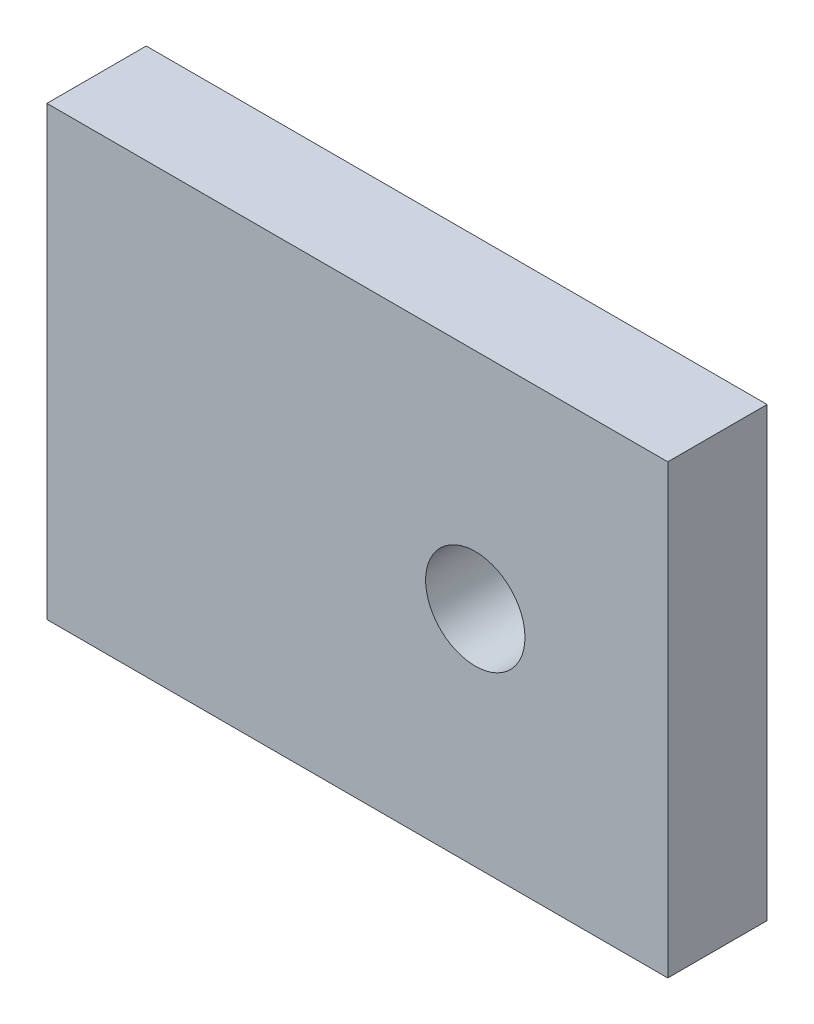
ISO-10303-21;
HEADER;
FILE_DESCRIPTION(('STEP AP214'),'2;1');
FILE_NAME('part.step','',(''),(''),'','','');
FILE_SCHEMA(('AUTOMOTIVE_DESIGN { 1 0 10303 214 1 1 1 1 }'));
ENDSEC;
DATA;
#1=APPLICATION_CONTEXT('core data for automotive mechanical design processes');
#2=APPLICATION_PROTOCOL_DEFINITION('international standard','automotive_design',2000,#1);
#3=PRODUCT_CONTEXT('',#1,'mechanical');
#4=PRODUCT('Part','Part','',(#3));
#5=PRODUCT_RELATED_PRODUCT_CATEGORY('part','',(#4));
#6=PRODUCT_DEFINITION_FORMATION('','',#4);
#7=PRODUCT_DEFINITION_CONTEXT('part definition',#1,'design');
#8=PRODUCT_DEFINITION('design','',#6,#7);
#9=PRODUCT_DEFINITION_SHAPE('','',#8);
#10=(LENGTH_UNIT() NAMED_UNIT(*) SI_UNIT(.MILLI.,.METRE.));
#11=(NAMED_UNIT(*) PLANE_ANGLE_UNIT() SI_UNIT($,.RADIAN.));
#12=(NAMED_UNIT(*) SI_UNIT($,.STERADIAN.) SOLID_ANGLE_UNIT());
#13=UNCERTAINTY_MEASURE_WITH_UNIT(LENGTH_MEASURE(1.E-05),#10,'distance_accuracy_value','');
#14=(GEOMETRIC_REPRESENTATION_CONTEXT(3) GLOBAL_UNCERTAINTY_ASSIGNED_CONTEXT((#13)) GLOBAL_UNIT_ASSIGNED_CONTEXT((#10,
#11,#12)) REPRESENTATION_CONTEXT('',''));
#15=CARTESIAN_POINT('',(0.,0.,0.));
#16=DIRECTION('',(0.,0.,1.));
#17=DIRECTION('',(1.,0.,0.));
#18=AXIS2_PLACEMENT_3D('',#15,#16,#17);
#19=CARTESIAN_POINT('',(12.5,-9.,4.));
#20=DIRECTION('',(-1.,0.,0.));
#21=DIRECTION('',(0.,0.,1.));
#22=AXIS2_PLACEMENT_3D('',#19,#20,#21);
#23=PLANE('',#22);
#24=DIRECTION('',(0.,1.,0.));
#25=VECTOR('',#24,1.);
#26=CARTESIAN_POINT('',(12.5,-9.,0.));
#27=LINE('',#26,#25);
#28=CARTESIAN_POINT('',(12.5,-9.,0.));
#29=VERTEX_POINT('',#28);
#30=CARTESIAN_POINT('',(12.5,9.,0.));
#31=VERTEX_POINT('',#30);
#32=EDGE_CURVE('E96',#29,#31,#27,.T.);
#33=ORIENTED_EDGE('',*,*,#32,.T.);
#34=DIRECTION('',(0.,0.,-1.));
#35=VECTOR('',#34,1.);
#36=CARTESIAN_POINT('',(12.5,9.,4.));
#37=LINE('',#36,#35);
#38=CARTESIAN_POINT('',(12.5,9.,4.));
#39=VERTEX_POINT('',#38);
#40=EDGE_CURVE('E11',#39,#31,#37,.T.);
#41=ORIENTED_EDGE('',*,*,#40,.F.);
#42=DIRECTION('',(0.,1.,0.));
#43=VECTOR('',#42,1.);
#44=CARTESIAN_POINT('',(12.5,-9.,4.));
#45=LINE('',#44,#43);
#46=CARTESIAN_POINT('',(12.5,-9.,4.));
#47=VERTEX_POINT('',#46);
#48=EDGE_CURVE('E84',#47,#39,#45,.T.);
#49=ORIENTED_EDGE('',*,*,#48,.F.);
#50=DIRECTION('',(0.,0.,-1.));
#51=VECTOR('',#50,1.);
#52=CARTESIAN_POINT('',(12.5,-9.,4.));
#53=LINE('',#52,#51);
#54=EDGE_CURVE('E92',#47,#29,#53,.T.);
#55=ORIENTED_EDGE('',*,*,#54,.T.);
#56=EDGE_LOOP('',(#33,#41,#49,#55));
#57=FACE_BOUND('',#56,.T.);
#58=ADVANCED_FACE('F33',(#57),#23,.F.);
#59=CARTESIAN_POINT('',(-12.5,9.,4.));
#60=DIRECTION('',(0.,-1.,0.));
#61=DIRECTION('',(0.,0.,-1.));
#62=AXIS2_PLACEMENT_3D('',#59,#60,#61);
#63=PLANE('',#62);
#64=DIRECTION('',(-1.,0.,0.));
#65=VECTOR('',#64,1.);
#66=CARTESIAN_POINT('',(-12.5,9.,0.));
#67=LINE('',#66,#65);
#68=CARTESIAN_POINT('',(-12.5,9.,0.));
#69=VERTEX_POINT('',#68);
#70=EDGE_CURVE('E88',#31,#69,#67,.T.);
#71=ORIENTED_EDGE('',*,*,#70,.T.);
#72=DIRECTION('',(0.,0.,-1.));
#73=VECTOR('',#72,1.);
#74=CARTESIAN_POINT('',(-12.5,9.,4.));
#75=LINE('',#74,#73);
#76=CARTESIAN_POINT('',(-12.5,9.,4.));
#77=VERTEX_POINT('',#76);
#78=EDGE_CURVE('E41',#77,#69,#75,.T.);
#79=ORIENTED_EDGE('',*,*,#78,.F.);
#80=DIRECTION('',(-1.,0.,0.));
#81=VECTOR('',#80,1.);
#82=CARTESIAN_POINT('',(-12.5,9.,4.));
#83=LINE('',#82,#81);
#84=EDGE_CURVE('E79',#39,#77,#83,.T.);
#85=ORIENTED_EDGE('',*,*,#84,.F.);
#86=ORIENTED_EDGE('',*,*,#40,.T.);
#87=EDGE_LOOP('',(#71,#79,#85,#86));
#88=FACE_BOUND('',#87,.T.);
#89=ADVANCED_FACE('F87',(#88),#63,.F.);
#90=CARTESIAN_POINT('',(-12.5,-9.,4.));
#91=DIRECTION('',(1.,0.,0.));
#92=DIRECTION('',(0.,0.,-1.));
#93=AXIS2_PLACEMENT_3D('',#90,#91,#92);
#94=PLANE('',#93);
#95=DIRECTION('',(0.,-1.,0.));
#96=VECTOR('',#95,1.);
#97=CARTESIAN_POINT('',(-12.5,-9.,0.));
#98=LINE('',#97,#96);
#99=CARTESIAN_POINT('',(-12.5,-9.,0.));
#100=VERTEX_POINT('',#99);
#101=EDGE_CURVE('E66',#69,#100,#98,.T.);
#102=ORIENTED_EDGE('',*,*,#101,.T.);
#103=DIRECTION('',(0.,0.,-1.));
#104=VECTOR('',#103,1.);
#105=CARTESIAN_POINT('',(-12.5,-9.,4.));
#106=LINE('',#105,#104);
#107=CARTESIAN_POINT('',(-12.5,-9.,4.));
#108=VERTEX_POINT('',#107);
#109=EDGE_CURVE('E89',#108,#100,#106,.T.);
#110=ORIENTED_EDGE('',*,*,#109,.F.);
#111=DIRECTION('',(0.,-1.,0.));
#112=VECTOR('',#111,1.);
#113=CARTESIAN_POINT('',(-12.5,-9.,4.));
#114=LINE('',#113,#112);
#115=EDGE_CURVE('E82',#77,#108,#114,.T.);
#116=ORIENTED_EDGE('',*,*,#115,.F.);
#117=ORIENTED_EDGE('',*,*,#78,.T.);
#118=EDGE_LOOP('',(#102,#110,#116,#117));
#119=FACE_BOUND('',#118,.T.);
#120=ADVANCED_FACE('F90',(#119),#94,.F.);
#121=CARTESIAN_POINT('',(-12.5,-9.,4.));
#122=DIRECTION('',(0.,1.,0.));
#123=DIRECTION('',(0.,0.,1.));
#124=AXIS2_PLACEMENT_3D('',#121,#122,#123);
#125=PLANE('',#124);
#126=DIRECTION('',(1.,0.,0.));
#127=VECTOR('',#126,1.);
#128=CARTESIAN_POINT('',(-12.5,-9.,0.));
#129=LINE('',#128,#127);
#130=EDGE_CURVE('E72',#100,#29,#129,.T.);
#131=ORIENTED_EDGE('',*,*,#130,.T.);
#132=ORIENTED_EDGE('',*,*,#54,.F.);
#133=DIRECTION('',(1.,0.,0.));
#134=VECTOR('',#133,1.);
#135=CARTESIAN_POINT('',(-12.5,-9.,4.));
#136=LINE('',#135,#134);
#137=EDGE_CURVE('E49',#108,#47,#136,.T.);
#138=ORIENTED_EDGE('',*,*,#137,.F.);
#139=ORIENTED_EDGE('',*,*,#109,.T.);
#140=EDGE_LOOP('',(#131,#132,#138,#139));
#141=FACE_BOUND('',#140,.T.);
#142=ADVANCED_FACE('F104',(#141),#125,.F.);
#143=CARTESIAN_POINT('',(0.,0.,4.));
#144=DIRECTION('',(0.,0.,-1.));
#145=DIRECTION('',(-1.,0.,0.));
#146=AXIS2_PLACEMENT_3D('',#143,#144,#145);
#147=PLANE('',#146);
#148=CARTESIAN_POINT('',(4.75,0.,4.));
#149=DIRECTION('',(0.,0.,1.));
#150=DIRECTION('',(1.,0.,0.));
#151=AXIS2_PLACEMENT_3D('',#148,#149,#150);
#152=CIRCLE('',#151,2.);
#153=CARTESIAN_POINT('',(6.75,0.,4.));
#154=VERTEX_POINT('',#153);
#155=EDGE_CURVE('E99',#154,#154,#152,.T.);
#156=ORIENTED_EDGE('',*,*,#155,.F.);
#157=EDGE_LOOP('',(#156));
#158=FACE_BOUND('',#157,.T.);
#159=ORIENTED_EDGE('',*,*,#48,.T.);
#160=ORIENTED_EDGE('',*,*,#84,.T.);
#161=ORIENTED_EDGE('',*,*,#115,.T.);
#162=ORIENTED_EDGE('',*,*,#137,.T.);
#163=EDGE_LOOP('',(#159,#160,#161,#162));
#164=FACE_BOUND('',#163,.T.);
#165=ADVANCED_FACE('F80',(#158,#164),#147,.F.);
#166=CARTESIAN_POINT('',(0.,0.,0.));
#167=DIRECTION('',(0.,0.,-1.));
#168=DIRECTION('',(-1.,0.,0.));
#169=AXIS2_PLACEMENT_3D('',#166,#167,#168);
#170=PLANE('',#169);
#171=CARTESIAN_POINT('',(4.75,0.,0.));
#172=DIRECTION('',(0.,0.,-1.));
#173=DIRECTION('',(-1.,0.,0.));
#174=AXIS2_PLACEMENT_3D('',#171,#172,#173);
#175=CIRCLE('',#174,2.);
#176=CARTESIAN_POINT('',(2.75,0.,0.));
#177=VERTEX_POINT('',#176);
#178=EDGE_CURVE('E110',#177,#177,#175,.F.);
#179=ORIENTED_EDGE('',*,*,#178,.T.);
#180=EDGE_LOOP('',(#179));
#181=FACE_BOUND('',#180,.T.);
#182=ORIENTED_EDGE('',*,*,#32,.F.);
#183=ORIENTED_EDGE('',*,*,#130,.F.);
#184=ORIENTED_EDGE('',*,*,#101,.F.);
#185=ORIENTED_EDGE('',*,*,#70,.F.);
#186=EDGE_LOOP('',(#182,#183,#184,#185));
#187=FACE_BOUND('',#186,.T.);
#188=ADVANCED_FACE('F107',(#181,#187),#170,.T.);
#189=CARTESIAN_POINT('',(4.75,0.,-0.00100000000000013));
#190=DIRECTION('',(0.,0.,1.));
#191=DIRECTION('',(1.,0.,0.));
#192=AXIS2_PLACEMENT_3D('',#189,#190,#191);
#193=CYLINDRICAL_SURFACE('',#192,2.);
#194=ORIENTED_EDGE('',*,*,#178,.F.);
#195=EDGE_LOOP('',(#194));
#196=FACE_BOUND('',#195,.T.);
#197=ORIENTED_EDGE('',*,*,#155,.T.);
#198=EDGE_LOOP('',(#197));
#199=FACE_BOUND('',#198,.T.);
#200=ADVANCED_FACE('F116',(#196,#199),#193,.F.);
#201=CLOSED_SHELL('',(#58,#89,#120,#142,#165,#188,#200));
#202=MANIFOLD_SOLID_BREP('B2',#201);
#203=ADVANCED_BREP_SHAPE_REPRESENTATION('',(#18,#202),#14);
#204=SHAPE_DEFINITION_REPRESENTATION(#9,#203);
ENDSEC;
END-ISO-10303-21;
